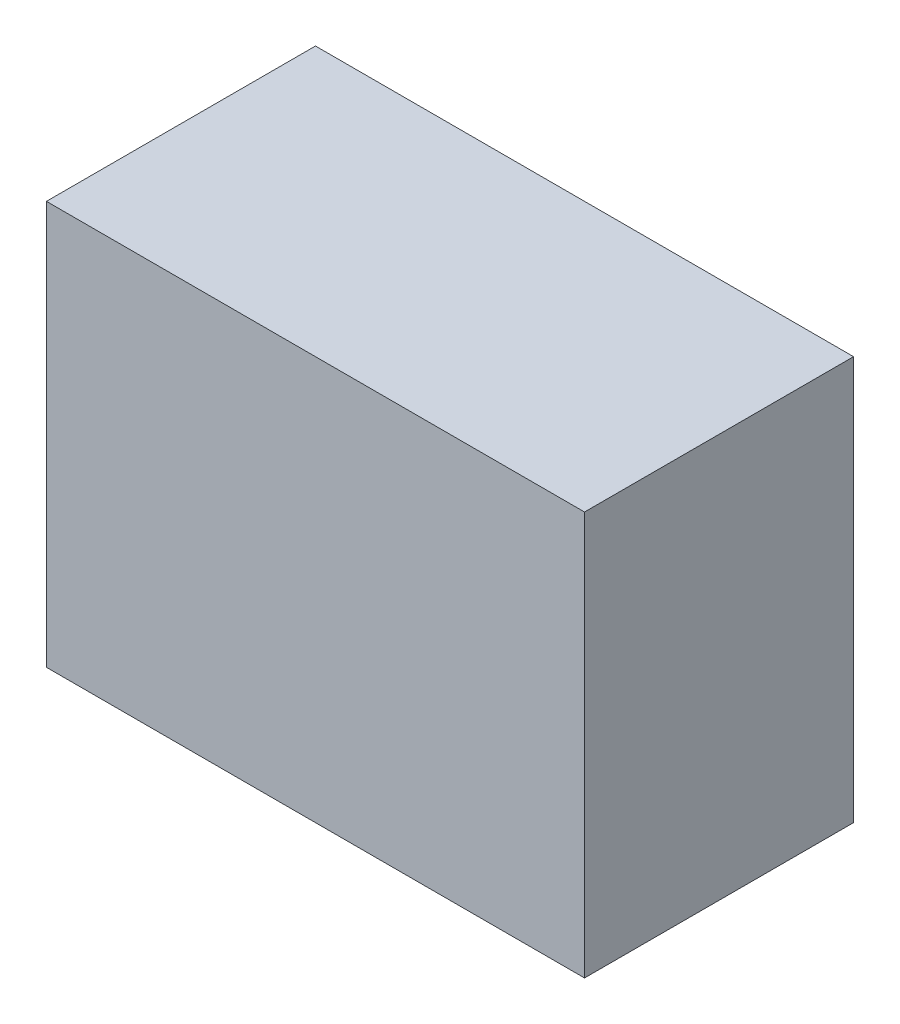
ISO-10303-21;
HEADER;
FILE_DESCRIPTION(('STEP AP214'),'2;1');
FILE_NAME('part.step','',(''),(''),'','','');
FILE_SCHEMA(('AUTOMOTIVE_DESIGN { 1 0 10303 214 1 1 1 1 }'));
ENDSEC;
DATA;
#1=APPLICATION_CONTEXT('core data for automotive mechanical design processes');
#2=APPLICATION_PROTOCOL_DEFINITION('international standard','automotive_design',2000,#1);
#3=PRODUCT_CONTEXT('',#1,'mechanical');
#4=PRODUCT('Part','Part','',(#3));
#5=PRODUCT_RELATED_PRODUCT_CATEGORY('part','',(#4));
#6=PRODUCT_DEFINITION_FORMATION('','',#4);
#7=PRODUCT_DEFINITION_CONTEXT('part definition',#1,'design');
#8=PRODUCT_DEFINITION('design','',#6,#7);
#9=PRODUCT_DEFINITION_SHAPE('','',#8);
#10=(LENGTH_UNIT() NAMED_UNIT(*) SI_UNIT(.MILLI.,.METRE.));
#11=(NAMED_UNIT(*) PLANE_ANGLE_UNIT() SI_UNIT($,.RADIAN.));
#12=(NAMED_UNIT(*) SI_UNIT($,.STERADIAN.) SOLID_ANGLE_UNIT());
#13=UNCERTAINTY_MEASURE_WITH_UNIT(LENGTH_MEASURE(1.E-05),#10,'distance_accuracy_value','');
#14=(GEOMETRIC_REPRESENTATION_CONTEXT(3) GLOBAL_UNCERTAINTY_ASSIGNED_CONTEXT((#13)) GLOBAL_UNIT_ASSIGNED_CONTEXT((#10,
#11,#12)) REPRESENTATION_CONTEXT('',''));
#15=CARTESIAN_POINT('',(0.,0.,0.));
#16=DIRECTION('',(0.,0.,1.));
#17=DIRECTION('',(1.,0.,0.));
#18=AXIS2_PLACEMENT_3D('',#15,#16,#17);
#19=CARTESIAN_POINT('',(10.,-7.5,10.));
#20=DIRECTION('',(-1.,0.,0.));
#21=DIRECTION('',(0.,0.,1.));
#22=AXIS2_PLACEMENT_3D('',#19,#20,#21);
#23=PLANE('',#22);
#24=DIRECTION('',(0.,1.,0.));
#25=VECTOR('',#24,1.);
#26=CARTESIAN_POINT('',(10.,-7.5,0.));
#27=LINE('',#26,#25);
#28=CARTESIAN_POINT('',(10.,-7.5,0.));
#29=VERTEX_POINT('',#28);
#30=CARTESIAN_POINT('',(10.,7.5,0.));
#31=VERTEX_POINT('',#30);
#32=EDGE_CURVE('E113',#29,#31,#27,.T.);
#33=ORIENTED_EDGE('',*,*,#32,.T.);
#34=DIRECTION('',(0.,0.,-1.));
#35=VECTOR('',#34,1.);
#36=CARTESIAN_POINT('',(10.,7.5,10.));
#37=LINE('',#36,#35);
#38=CARTESIAN_POINT('',(10.,7.5,10.));
#39=VERTEX_POINT('',#38);
#40=EDGE_CURVE('E11',#39,#31,#37,.T.);
#41=ORIENTED_EDGE('',*,*,#40,.F.);
#42=DIRECTION('',(0.,1.,0.));
#43=VECTOR('',#42,1.);
#44=CARTESIAN_POINT('',(10.,-7.5,10.));
#45=LINE('',#44,#43);
#46=CARTESIAN_POINT('',(10.,-7.5,10.));
#47=VERTEX_POINT('',#46);
#48=EDGE_CURVE('E97',#47,#39,#45,.T.);
#49=ORIENTED_EDGE('',*,*,#48,.F.);
#50=DIRECTION('',(0.,0.,-1.));
#51=VECTOR('',#50,1.);
#52=CARTESIAN_POINT('',(10.,-7.5,10.));
#53=LINE('',#52,#51);
#54=EDGE_CURVE('E109',#47,#29,#53,.T.);
#55=ORIENTED_EDGE('',*,*,#54,.T.);
#56=EDGE_LOOP('',(#33,#41,#49,#55));
#57=FACE_BOUND('',#56,.T.);
#58=ADVANCED_FACE('F45',(#57),#23,.F.);
#59=CARTESIAN_POINT('',(-10.,7.5,10.));
#60=DIRECTION('',(0.,-1.,0.));
#61=DIRECTION('',(0.,0.,-1.));
#62=AXIS2_PLACEMENT_3D('',#59,#60,#61);
#63=PLANE('',#62);
#64=DIRECTION('',(-1.,0.,0.));
#65=VECTOR('',#64,1.);
#66=CARTESIAN_POINT('',(-10.,7.5,0.));
#67=LINE('',#66,#65);
#68=CARTESIAN_POINT('',(-10.,7.5,0.));
#69=VERTEX_POINT('',#68);
#70=EDGE_CURVE('E102',#31,#69,#67,.T.);
#71=ORIENTED_EDGE('',*,*,#70,.T.);
#72=DIRECTION('',(0.,0.,-1.));
#73=VECTOR('',#72,1.);
#74=CARTESIAN_POINT('',(-10.,7.5,10.));
#75=LINE('',#74,#73);
#76=CARTESIAN_POINT('',(-10.,7.5,10.));
#77=VERTEX_POINT('',#76);
#78=EDGE_CURVE('E54',#77,#69,#75,.T.);
#79=ORIENTED_EDGE('',*,*,#78,.F.);
#80=DIRECTION('',(-1.,0.,0.));
#81=VECTOR('',#80,1.);
#82=CARTESIAN_POINT('',(-10.,7.5,10.));
#83=LINE('',#82,#81);
#84=EDGE_CURVE('E92',#39,#77,#83,.T.);
#85=ORIENTED_EDGE('',*,*,#84,.F.);
#86=ORIENTED_EDGE('',*,*,#40,.T.);
#87=EDGE_LOOP('',(#71,#79,#85,#86));
#88=FACE_BOUND('',#87,.T.);
#89=ADVANCED_FACE('F101',(#88),#63,.F.);
#90=CARTESIAN_POINT('',(-10.,-7.5,10.));
#91=DIRECTION('',(1.,0.,0.));
#92=DIRECTION('',(0.,0.,-1.));
#93=AXIS2_PLACEMENT_3D('',#90,#91,#92);
#94=PLANE('',#93);
#95=DIRECTION('',(0.,-1.,0.));
#96=VECTOR('',#95,1.);
#97=CARTESIAN_POINT('',(-10.,-7.5,0.));
#98=LINE('',#97,#96);
#99=CARTESIAN_POINT('',(-10.,-7.5,0.));
#100=VERTEX_POINT('',#99);
#101=EDGE_CURVE('E79',#69,#100,#98,.T.);
#102=ORIENTED_EDGE('',*,*,#101,.T.);
#103=DIRECTION('',(0.,0.,-1.));
#104=VECTOR('',#103,1.);
#105=CARTESIAN_POINT('',(-10.,-7.5,10.));
#106=LINE('',#105,#104);
#107=CARTESIAN_POINT('',(-10.,-7.5,10.));
#108=VERTEX_POINT('',#107);
#109=EDGE_CURVE('E104',#108,#100,#106,.T.);
#110=ORIENTED_EDGE('',*,*,#109,.F.);
#111=DIRECTION('',(0.,-1.,0.));
#112=VECTOR('',#111,1.);
#113=CARTESIAN_POINT('',(-10.,-7.5,10.));
#114=LINE('',#113,#112);
#115=EDGE_CURVE('E95',#77,#108,#114,.T.);
#116=ORIENTED_EDGE('',*,*,#115,.F.);
#117=ORIENTED_EDGE('',*,*,#78,.T.);
#118=EDGE_LOOP('',(#102,#110,#116,#117));
#119=FACE_BOUND('',#118,.T.);
#120=ADVANCED_FACE('F105',(#119),#94,.F.);
#121=CARTESIAN_POINT('',(-10.,-7.5,10.));
#122=DIRECTION('',(0.,1.,0.));
#123=DIRECTION('',(0.,0.,1.));
#124=AXIS2_PLACEMENT_3D('',#121,#122,#123);
#125=PLANE('',#124);
#126=DIRECTION('',(1.,0.,0.));
#127=VECTOR('',#126,1.);
#128=CARTESIAN_POINT('',(-10.,-7.5,0.));
#129=LINE('',#128,#127);
#130=EDGE_CURVE('E85',#100,#29,#129,.T.);
#131=ORIENTED_EDGE('',*,*,#130,.T.);
#132=ORIENTED_EDGE('',*,*,#54,.F.);
#133=DIRECTION('',(1.,0.,0.));
#134=VECTOR('',#133,1.);
#135=CARTESIAN_POINT('',(-10.,-7.5,10.));
#136=LINE('',#135,#134);
#137=EDGE_CURVE('E62',#108,#47,#136,.T.);
#138=ORIENTED_EDGE('',*,*,#137,.F.);
#139=ORIENTED_EDGE('',*,*,#109,.T.);
#140=EDGE_LOOP('',(#131,#132,#138,#139));
#141=FACE_BOUND('',#140,.T.);
#142=ADVANCED_FACE('F126',(#141),#125,.F.);
#143=CARTESIAN_POINT('',(0.,0.,10.));
#144=DIRECTION('',(0.,0.,-1.));
#145=DIRECTION('',(-1.,0.,0.));
#146=AXIS2_PLACEMENT_3D('',#143,#144,#145);
#147=PLANE('',#146);
#148=ORIENTED_EDGE('',*,*,#48,.T.);
#149=ORIENTED_EDGE('',*,*,#84,.T.);
#150=ORIENTED_EDGE('',*,*,#115,.T.);
#151=ORIENTED_EDGE('',*,*,#137,.T.);
#152=EDGE_LOOP('',(#148,#149,#150,#151));
#153=FACE_BOUND('',#152,.T.);
#154=ADVANCED_FACE('F93',(#153),#147,.F.);
#155=CARTESIAN_POINT('',(0.,0.,0.));
#156=DIRECTION('',(0.,0.,-1.));
#157=DIRECTION('',(-1.,0.,0.));
#158=AXIS2_PLACEMENT_3D('',#155,#156,#157);
#159=PLANE('',#158);
#160=ORIENTED_EDGE('',*,*,#32,.F.);
#161=ORIENTED_EDGE('',*,*,#130,.F.);
#162=ORIENTED_EDGE('',*,*,#101,.F.);
#163=ORIENTED_EDGE('',*,*,#70,.F.);
#164=EDGE_LOOP('',(#160,#161,#162,#163));
#165=FACE_BOUND('',#164,.T.);
#166=ADVANCED_FACE('F129',(#165),#159,.T.);
#167=CLOSED_SHELL('',(#58,#89,#120,#142,#154,#166));
#168=MANIFOLD_SOLID_BREP('B2',#167);
#169=ADVANCED_BREP_SHAPE_REPRESENTATION('',(#18,#168),#14);
#170=SHAPE_DEFINITION_REPRESENTATION(#9,#169);
ENDSEC;
END-ISO-10303-21;
